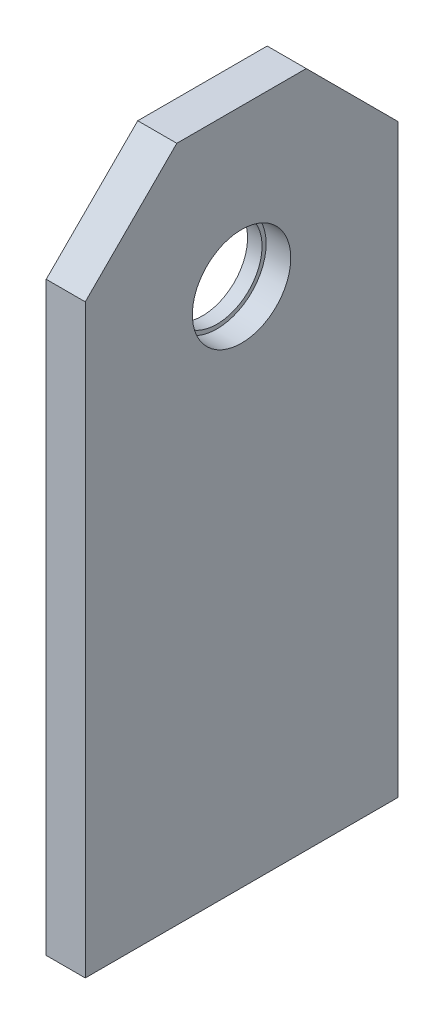
ISO-10303-21;
HEADER;
FILE_DESCRIPTION(('STEP AP214'),'2;1');
FILE_NAME('part.step','',(''),(''),'','','');
FILE_SCHEMA(('AUTOMOTIVE_DESIGN { 1 0 10303 214 1 1 1 1 }'));
ENDSEC;
DATA;
#1=APPLICATION_CONTEXT('core data for automotive mechanical design processes');
#2=APPLICATION_PROTOCOL_DEFINITION('international standard','automotive_design',2000,#1);
#3=PRODUCT_CONTEXT('',#1,'mechanical');
#4=PRODUCT('Part','Part','',(#3));
#5=PRODUCT_RELATED_PRODUCT_CATEGORY('part','',(#4));
#6=PRODUCT_DEFINITION_FORMATION('','',#4);
#7=PRODUCT_DEFINITION_CONTEXT('part definition',#1,'design');
#8=PRODUCT_DEFINITION('design','',#6,#7);
#9=PRODUCT_DEFINITION_SHAPE('','',#8);
#10=(LENGTH_UNIT() NAMED_UNIT(*) SI_UNIT(.MILLI.,.METRE.));
#11=(NAMED_UNIT(*) PLANE_ANGLE_UNIT() SI_UNIT($,.RADIAN.));
#12=(NAMED_UNIT(*) SI_UNIT($,.STERADIAN.) SOLID_ANGLE_UNIT());
#13=UNCERTAINTY_MEASURE_WITH_UNIT(LENGTH_MEASURE(1.E-05),#10,'distance_accuracy_value','');
#14=(GEOMETRIC_REPRESENTATION_CONTEXT(3) GLOBAL_UNCERTAINTY_ASSIGNED_CONTEXT((#13)) GLOBAL_UNIT_ASSIGNED_CONTEXT((#10,
#11,#12)) REPRESENTATION_CONTEXT('',''));
#15=CARTESIAN_POINT('',(0.,0.,0.));
#16=DIRECTION('',(0.,0.,1.));
#17=DIRECTION('',(1.,0.,0.));
#18=AXIS2_PLACEMENT_3D('',#15,#16,#17);
#19=CARTESIAN_POINT('',(4.7625,0.,0.));
#20=DIRECTION('',(-1.,0.,0.));
#21=DIRECTION('',(0.,0.,1.));
#22=AXIS2_PLACEMENT_3D('',#19,#20,#21);
#23=CYLINDRICAL_SURFACE('',#22,11.);
#24=CARTESIAN_POINT('',(-4.7625,0.,0.));
#25=DIRECTION('',(1.,0.,0.));
#26=DIRECTION('',(0.,0.,-1.));
#27=AXIS2_PLACEMENT_3D('',#24,#25,#26);
#28=CIRCLE('',#27,11.);
#29=CARTESIAN_POINT('',(-4.7625,0.,11.));
#30=VERTEX_POINT('',#29);
#31=EDGE_CURVE('E131',#30,#30,#28,.T.);
#32=CARTESIAN_POINT('',(-1.2375,0.,0.));
#33=DIRECTION('',(1.,0.,0.));
#34=DIRECTION('',(0.,0.,-1.));
#35=AXIS2_PLACEMENT_3D('',#32,#33,#34);
#36=CIRCLE('',#35,11.);
#37=CARTESIAN_POINT('',(-1.2375,0.,11.));
#38=VERTEX_POINT('',#37);
#39=EDGE_CURVE('E45',#38,#38,#36,.T.);
#40=CARTESIAN_POINT('',(-4.7625,0.,11.));
#41=CARTESIAN_POINT('',(-4.72578125,0.,11.));
#42=CARTESIAN_POINT('',(-4.6890625,0.,11.));
#43=CARTESIAN_POINT('',(-4.615625,0.,11.));
#44=CARTESIAN_POINT('',(-4.57890625,0.,11.));
#45=CARTESIAN_POINT('',(-4.50546875,0.,11.));
#46=CARTESIAN_POINT('',(-4.46875,0.,11.));
#47=CARTESIAN_POINT('',(-4.3953125,0.,11.));
#48=CARTESIAN_POINT('',(-4.35859375,0.,11.));
#49=CARTESIAN_POINT('',(-4.28515625,0.,11.));
#50=CARTESIAN_POINT('',(-4.2484375,0.,11.));
#51=CARTESIAN_POINT('',(-4.175,0.,11.));
#52=CARTESIAN_POINT('',(-4.13828125,0.,11.));
#53=CARTESIAN_POINT('',(-4.06484375,0.,11.));
#54=CARTESIAN_POINT('',(-4.028125,0.,11.));
#55=CARTESIAN_POINT('',(-3.9546875,0.,11.));
#56=CARTESIAN_POINT('',(-3.91796875,0.,11.));
#57=CARTESIAN_POINT('',(-3.84453125,0.,11.));
#58=CARTESIAN_POINT('',(-3.8078125,0.,11.));
#59=CARTESIAN_POINT('',(-3.734375,0.,11.));
#60=CARTESIAN_POINT('',(-3.69765625,0.,11.));
#61=CARTESIAN_POINT('',(-3.62421875,0.,11.));
#62=CARTESIAN_POINT('',(-3.5875,0.,11.));
#63=CARTESIAN_POINT('',(-3.5140625,0.,11.));
#64=CARTESIAN_POINT('',(-3.47734375,0.,11.));
#65=CARTESIAN_POINT('',(-3.40390625,0.,11.));
#66=CARTESIAN_POINT('',(-3.3671875,0.,11.));
#67=CARTESIAN_POINT('',(-3.29375,0.,11.));
#68=CARTESIAN_POINT('',(-3.25703125,0.,11.));
#69=CARTESIAN_POINT('',(-3.18359375,0.,11.));
#70=CARTESIAN_POINT('',(-3.146875,0.,11.));
#71=CARTESIAN_POINT('',(-3.0734375,0.,11.));
#72=CARTESIAN_POINT('',(-3.03671875,0.,11.));
#73=CARTESIAN_POINT('',(-2.96328125,0.,11.));
#74=CARTESIAN_POINT('',(-2.9265625,0.,11.));
#75=CARTESIAN_POINT('',(-2.853125,0.,11.));
#76=CARTESIAN_POINT('',(-2.81640625,0.,11.));
#77=CARTESIAN_POINT('',(-2.74296875,0.,11.));
#78=CARTESIAN_POINT('',(-2.70625,0.,11.));
#79=CARTESIAN_POINT('',(-2.6328125,0.,11.));
#80=CARTESIAN_POINT('',(-2.59609375,0.,11.));
#81=CARTESIAN_POINT('',(-2.52265625,0.,11.));
#82=CARTESIAN_POINT('',(-2.4859375,0.,11.));
#83=CARTESIAN_POINT('',(-2.4125,0.,11.));
#84=CARTESIAN_POINT('',(-2.37578125,0.,11.));
#85=CARTESIAN_POINT('',(-2.30234375,0.,11.));
#86=CARTESIAN_POINT('',(-2.265625,0.,11.));
#87=CARTESIAN_POINT('',(-2.1921875,0.,11.));
#88=CARTESIAN_POINT('',(-2.15546875,0.,11.));
#89=CARTESIAN_POINT('',(-2.08203125,0.,11.));
#90=CARTESIAN_POINT('',(-2.0453125,0.,11.));
#91=CARTESIAN_POINT('',(-1.971875,0.,11.));
#92=CARTESIAN_POINT('',(-1.93515625,0.,11.));
#93=CARTESIAN_POINT('',(-1.86171875,0.,11.));
#94=CARTESIAN_POINT('',(-1.825,0.,11.));
#95=CARTESIAN_POINT('',(-1.7515625,0.,11.));
#96=CARTESIAN_POINT('',(-1.71484375,0.,11.));
#97=CARTESIAN_POINT('',(-1.64140625,0.,11.));
#98=CARTESIAN_POINT('',(-1.6046875,0.,11.));
#99=CARTESIAN_POINT('',(-1.53125,0.,11.));
#100=CARTESIAN_POINT('',(-1.49453125,0.,11.));
#101=CARTESIAN_POINT('',(-1.42109375,0.,11.));
#102=CARTESIAN_POINT('',(-1.384375,0.,11.));
#103=CARTESIAN_POINT('',(-1.3109375,0.,11.));
#104=CARTESIAN_POINT('',(-1.27421875,0.,11.));
#105=CARTESIAN_POINT('',(-1.2375,0.,11.));
#106=B_SPLINE_CURVE_WITH_KNOTS('',3,(#40,#41,#42,#43,#44,#45,#46,#47,#48,#49,#50,#51,#52,#53,
#54,#55,#56,#57,#58,#59,#60,#61,#62,#63,#64,#65,#66,#67,#68,#69,#70,#71,#72,#73,#74,#75,#76,#77,
#78,#79,#80,#81,#82,#83,#84,#85,#86,#87,#88,#89,#90,#91,#92,#93,#94,#95,#96,#97,#98,#99,#100,
#101,#102,#103,#104,#105),.UNSPECIFIED.,.F.,.F.,(4,2,2,2,2,2,2,2,2,2,2,2,2,2,2,2,2,2,2,2,2,2,2,
2,2,2,2,2,2,2,2,2,4),(0.,0.11015625,0.2203125,0.33046875,0.440625,0.55078125,0.6609375,
0.77109375,0.88125,0.99140625,1.1015625,1.21171875,1.321875,1.43203125,1.5421875,1.65234375,
1.7625,1.87265625,1.9828125,2.09296875,2.203125,2.31328125,2.4234375,2.53359375,2.64375,
2.75390625,2.8640625,2.97421875,3.084375,3.19453125,3.3046875,3.41484375,3.525),.UNSPECIFIED.);
#107=EDGE_CURVE('BSEAM41',#30,#38,#106,.T.);
#108=ORIENTED_EDGE('',*,*,#31,.F.);
#109=ORIENTED_EDGE('',*,*,#39,.T.);
#110=ORIENTED_EDGE('',*,*,#107,.T.);
#111=ORIENTED_EDGE('',*,*,#107,.F.);
#112=EDGE_LOOP('',(#108,#110,#109,#111));
#113=FACE_BOUND('',#112,.T.);
#114=ADVANCED_FACE('F41',(#113),#23,.F.);
#115=CARTESIAN_POINT('',(4.7625,0.,0.));
#116=DIRECTION('',(-1.,0.,0.));
#117=DIRECTION('',(0.,0.,1.));
#118=AXIS2_PLACEMENT_3D('',#115,#116,#117);
#119=PLANE('',#118);
#120=CARTESIAN_POINT('',(4.7625,0.,0.));
#121=DIRECTION('',(1.,0.,0.));
#122=DIRECTION('',(0.,0.,-1.));
#123=AXIS2_PLACEMENT_3D('',#120,#121,#122);
#124=CIRCLE('',#123,12.);
#125=CARTESIAN_POINT('',(4.7625,0.,-12.));
#126=VERTEX_POINT('',#125);
#127=EDGE_CURVE('E207',#126,#126,#124,.T.);
#128=ORIENTED_EDGE('',*,*,#127,.F.);
#129=EDGE_LOOP('',(#128));
#130=FACE_BOUND('',#129,.T.);
#131=DIRECTION('',(0.,0.,-1.));
#132=VECTOR('',#131,1.);
#133=CARTESIAN_POINT('',(4.7625,-127.,-38.1));
#134=LINE('',#133,#132);
#135=CARTESIAN_POINT('',(4.7625,-127.,38.1));
#136=VERTEX_POINT('',#135);
#137=CARTESIAN_POINT('',(4.7625,-127.,-38.1));
#138=VERTEX_POINT('',#137);
#139=EDGE_CURVE('E138',#136,#138,#134,.T.);
#140=ORIENTED_EDGE('',*,*,#139,.T.);
#141=DIRECTION('',(0.,1.,0.));
#142=VECTOR('',#141,1.);
#143=CARTESIAN_POINT('',(4.7625,15.7815367264146,-38.1));
#144=LINE('',#143,#142);
#145=CARTESIAN_POINT('',(4.7625,15.7815367264146,-38.1));
#146=VERTEX_POINT('',#145);
#147=EDGE_CURVE('E96',#138,#146,#144,.T.);
#148=ORIENTED_EDGE('',*,*,#147,.T.);
#149=DIRECTION('',(0.,0.707106781186551,0.707106781186544));
#150=VECTOR('',#149,1.);
#151=CARTESIAN_POINT('',(4.7625,38.0999999999999,-15.781536726415));
#152=LINE('',#151,#150);
#153=CARTESIAN_POINT('',(4.7625,38.0999999999999,-15.781536726415));
#154=VERTEX_POINT('',#153);
#155=EDGE_CURVE('E109',#146,#154,#152,.T.);
#156=ORIENTED_EDGE('',*,*,#155,.T.);
#157=DIRECTION('',(0.,0.,1.));
#158=VECTOR('',#157,1.);
#159=CARTESIAN_POINT('',(4.7625,38.0999999999999,15.781536726415));
#160=LINE('',#159,#158);
#161=CARTESIAN_POINT('',(4.7625,38.0999999999999,15.781536726415));
#162=VERTEX_POINT('',#161);
#163=EDGE_CURVE('E103',#154,#162,#160,.T.);
#164=ORIENTED_EDGE('',*,*,#163,.T.);
#165=DIRECTION('',(0.,-0.707106781186551,0.707106781186544));
#166=VECTOR('',#165,1.);
#167=CARTESIAN_POINT('',(4.7625,15.7815367264146,38.1));
#168=LINE('',#167,#166);
#169=CARTESIAN_POINT('',(4.7625,15.7815367264146,38.1));
#170=VERTEX_POINT('',#169);
#171=EDGE_CURVE('E107',#162,#170,#168,.T.);
#172=ORIENTED_EDGE('',*,*,#171,.T.);
#173=DIRECTION('',(0.,-1.,0.));
#174=VECTOR('',#173,1.);
#175=CARTESIAN_POINT('',(4.7625,-127.,38.1));
#176=LINE('',#175,#174);
#177=EDGE_CURVE('E59',#170,#136,#176,.T.);
#178=ORIENTED_EDGE('',*,*,#177,.T.);
#179=EDGE_LOOP('',(#140,#148,#156,#164,#172,#178));
#180=FACE_BOUND('',#179,.T.);
#181=ADVANCED_FACE('F105',(#130,#180),#119,.F.);
#182=CARTESIAN_POINT('',(-4.7625,0.,0.));
#183=DIRECTION('',(-1.,0.,0.));
#184=DIRECTION('',(0.,0.,1.));
#185=AXIS2_PLACEMENT_3D('',#182,#183,#184);
#186=PLANE('',#185);
#187=DIRECTION('',(0.,0.,-1.));
#188=VECTOR('',#187,1.);
#189=CARTESIAN_POINT('',(-4.7625,-127.,-38.1));
#190=LINE('',#189,#188);
#191=CARTESIAN_POINT('',(-4.7625,-127.,38.1));
#192=VERTEX_POINT('',#191);
#193=CARTESIAN_POINT('',(-4.7625,-127.,-38.1));
#194=VERTEX_POINT('',#193);
#195=EDGE_CURVE('E127',#192,#194,#190,.T.);
#196=ORIENTED_EDGE('',*,*,#195,.F.);
#197=DIRECTION('',(0.,-1.,0.));
#198=VECTOR('',#197,1.);
#199=CARTESIAN_POINT('',(-4.7625,-127.,38.1));
#200=LINE('',#199,#198);
#201=CARTESIAN_POINT('',(-4.7625,15.7815367264146,38.1));
#202=VERTEX_POINT('',#201);
#203=EDGE_CURVE('E88',#202,#192,#200,.T.);
#204=ORIENTED_EDGE('',*,*,#203,.F.);
#205=DIRECTION('',(0.,-0.707106781186551,0.707106781186544));
#206=VECTOR('',#205,1.);
#207=CARTESIAN_POINT('',(-4.7625,15.7815367264146,38.1));
#208=LINE('',#207,#206);
#209=CARTESIAN_POINT('',(-4.7625,38.0999999999999,15.781536726415));
#210=VERTEX_POINT('',#209);
#211=EDGE_CURVE('E82',#210,#202,#208,.T.);
#212=ORIENTED_EDGE('',*,*,#211,.F.);
#213=DIRECTION('',(0.,0.,1.));
#214=VECTOR('',#213,1.);
#215=CARTESIAN_POINT('',(-4.7625,38.0999999999999,15.781536726415));
#216=LINE('',#215,#214);
#217=CARTESIAN_POINT('',(-4.7625,38.0999999999999,-15.781536726415));
#218=VERTEX_POINT('',#217);
#219=EDGE_CURVE('E117',#218,#210,#216,.T.);
#220=ORIENTED_EDGE('',*,*,#219,.F.);
#221=DIRECTION('',(0.,0.707106781186551,0.707106781186544));
#222=VECTOR('',#221,1.);
#223=CARTESIAN_POINT('',(-4.7625,38.0999999999999,-15.781536726415));
#224=LINE('',#223,#222);
#225=CARTESIAN_POINT('',(-4.7625,15.7815367264146,-38.1));
#226=VERTEX_POINT('',#225);
#227=EDGE_CURVE('E133',#226,#218,#224,.T.);
#228=ORIENTED_EDGE('',*,*,#227,.F.);
#229=DIRECTION('',(0.,1.,0.));
#230=VECTOR('',#229,1.);
#231=CARTESIAN_POINT('',(-4.7625,15.7815367264146,-38.1));
#232=LINE('',#231,#230);
#233=EDGE_CURVE('E130',#194,#226,#232,.T.);
#234=ORIENTED_EDGE('',*,*,#233,.F.);
#235=EDGE_LOOP('',(#196,#204,#212,#220,#228,#234));
#236=FACE_BOUND('',#235,.T.);
#237=ORIENTED_EDGE('',*,*,#31,.T.);
#238=EDGE_LOOP('',(#237));
#239=FACE_BOUND('',#238,.T.);
#240=ADVANCED_FACE('F148',(#236,#239),#186,.T.);
#241=CARTESIAN_POINT('',(4.7625,-127.,-38.1));
#242=DIRECTION('',(0.,1.,0.));
#243=DIRECTION('',(0.,0.,1.));
#244=AXIS2_PLACEMENT_3D('',#241,#242,#243);
#245=PLANE('',#244);
#246=CARTESIAN_POINT('',(0.,-127.,30.1625));
#247=DIRECTION('',(0.,-1.,0.));
#248=DIRECTION('',(0.,0.,-1.));
#249=AXIS2_PLACEMENT_3D('',#246,#247,#248);
#250=CIRCLE('',#249,2.778125);
#251=CARTESIAN_POINT('',(0.,-127.,27.384375));
#252=VERTEX_POINT('',#251);
#253=EDGE_CURVE('E191',#252,#252,#250,.T.);
#254=ORIENTED_EDGE('',*,*,#253,.F.);
#255=EDGE_LOOP('',(#254));
#256=FACE_BOUND('',#255,.T.);
#257=CARTESIAN_POINT('',(0.,-127.,-30.1625));
#258=DIRECTION('',(0.,-1.,0.));
#259=DIRECTION('',(0.,0.,-1.));
#260=AXIS2_PLACEMENT_3D('',#257,#258,#259);
#261=CIRCLE('',#260,2.778125);
#262=CARTESIAN_POINT('',(0.,-127.,-32.940625));
#263=VERTEX_POINT('',#262);
#264=EDGE_CURVE('E194',#263,#263,#261,.T.);
#265=ORIENTED_EDGE('',*,*,#264,.F.);
#266=EDGE_LOOP('',(#265));
#267=FACE_BOUND('',#266,.T.);
#268=ORIENTED_EDGE('',*,*,#195,.T.);
#269=DIRECTION('',(-1.,0.,0.));
#270=VECTOR('',#269,1.);
#271=CARTESIAN_POINT('',(4.7625,-127.,-38.1));
#272=LINE('',#271,#270);
#273=EDGE_CURVE('E11',#138,#194,#272,.T.);
#274=ORIENTED_EDGE('',*,*,#273,.F.);
#275=ORIENTED_EDGE('',*,*,#139,.F.);
#276=DIRECTION('',(-1.,0.,0.));
#277=VECTOR('',#276,1.);
#278=CARTESIAN_POINT('',(4.7625,-127.,38.1));
#279=LINE('',#278,#277);
#280=EDGE_CURVE('E123',#136,#192,#279,.T.);
#281=ORIENTED_EDGE('',*,*,#280,.T.);
#282=EDGE_LOOP('',(#268,#274,#275,#281));
#283=FACE_BOUND('',#282,.T.);
#284=ADVANCED_FACE('F43',(#256,#267,#283),#245,.F.);
#285=CARTESIAN_POINT('',(4.7625,15.7815367264146,-38.1));
#286=DIRECTION('',(0.,0.,1.));
#287=DIRECTION('',(0.,-1.,0.));
#288=AXIS2_PLACEMENT_3D('',#285,#286,#287);
#289=PLANE('',#288);
#290=ORIENTED_EDGE('',*,*,#233,.T.);
#291=DIRECTION('',(-1.,0.,0.));
#292=VECTOR('',#291,1.);
#293=CARTESIAN_POINT('',(4.7625,15.7815367264146,-38.1));
#294=LINE('',#293,#292);
#295=EDGE_CURVE('E51',#146,#226,#294,.T.);
#296=ORIENTED_EDGE('',*,*,#295,.F.);
#297=ORIENTED_EDGE('',*,*,#147,.F.);
#298=ORIENTED_EDGE('',*,*,#273,.T.);
#299=EDGE_LOOP('',(#290,#296,#297,#298));
#300=FACE_BOUND('',#299,.T.);
#301=ADVANCED_FACE('F182',(#300),#289,.F.);
#302=CARTESIAN_POINT('',(4.7625,38.0999999999999,-15.781536726415));
#303=DIRECTION('',(0.,-0.707106781186544,0.707106781186551));
#304=DIRECTION('',(0.,-0.707106781186551,-0.707106781186544));
#305=AXIS2_PLACEMENT_3D('',#302,#303,#304);
#306=PLANE('',#305);
#307=ORIENTED_EDGE('',*,*,#227,.T.);
#308=DIRECTION('',(-1.,0.,0.));
#309=VECTOR('',#308,1.);
#310=CARTESIAN_POINT('',(4.7625,38.0999999999999,-15.781536726415));
#311=LINE('',#310,#309);
#312=EDGE_CURVE('E118',#154,#218,#311,.T.);
#313=ORIENTED_EDGE('',*,*,#312,.F.);
#314=ORIENTED_EDGE('',*,*,#155,.F.);
#315=ORIENTED_EDGE('',*,*,#295,.T.);
#316=EDGE_LOOP('',(#307,#313,#314,#315));
#317=FACE_BOUND('',#316,.T.);
#318=ADVANCED_FACE('F145',(#317),#306,.F.);
#319=CARTESIAN_POINT('',(4.7625,38.0999999999999,15.781536726415));
#320=DIRECTION('',(0.,-1.,0.));
#321=DIRECTION('',(0.,0.,-1.));
#322=AXIS2_PLACEMENT_3D('',#319,#320,#321);
#323=PLANE('',#322);
#324=ORIENTED_EDGE('',*,*,#219,.T.);
#325=DIRECTION('',(-1.,0.,0.));
#326=VECTOR('',#325,1.);
#327=CARTESIAN_POINT('',(4.7625,38.0999999999999,15.781536726415));
#328=LINE('',#327,#326);
#329=EDGE_CURVE('E114',#162,#210,#328,.T.);
#330=ORIENTED_EDGE('',*,*,#329,.F.);
#331=ORIENTED_EDGE('',*,*,#163,.F.);
#332=ORIENTED_EDGE('',*,*,#312,.T.);
#333=EDGE_LOOP('',(#324,#330,#331,#332));
#334=FACE_BOUND('',#333,.T.);
#335=ADVANCED_FACE('F115',(#334),#323,.F.);
#336=CARTESIAN_POINT('',(4.7625,15.7815367264146,38.1));
#337=DIRECTION('',(0.,-0.707106781186544,-0.707106781186551));
#338=DIRECTION('',(0.,0.707106781186551,-0.707106781186544));
#339=AXIS2_PLACEMENT_3D('',#336,#337,#338);
#340=PLANE('',#339);
#341=ORIENTED_EDGE('',*,*,#211,.T.);
#342=DIRECTION('',(-1.,0.,0.));
#343=VECTOR('',#342,1.);
#344=CARTESIAN_POINT('',(4.7625,15.7815367264146,38.1));
#345=LINE('',#344,#343);
#346=EDGE_CURVE('E119',#170,#202,#345,.T.);
#347=ORIENTED_EDGE('',*,*,#346,.F.);
#348=ORIENTED_EDGE('',*,*,#171,.F.);
#349=ORIENTED_EDGE('',*,*,#329,.T.);
#350=EDGE_LOOP('',(#341,#347,#348,#349));
#351=FACE_BOUND('',#350,.T.);
#352=ADVANCED_FACE('F121',(#351),#340,.F.);
#353=CARTESIAN_POINT('',(4.7625,-127.,38.1));
#354=DIRECTION('',(0.,0.,-1.));
#355=DIRECTION('',(0.,1.,0.));
#356=AXIS2_PLACEMENT_3D('',#353,#354,#355);
#357=PLANE('',#356);
#358=ORIENTED_EDGE('',*,*,#203,.T.);
#359=ORIENTED_EDGE('',*,*,#280,.F.);
#360=ORIENTED_EDGE('',*,*,#177,.F.);
#361=ORIENTED_EDGE('',*,*,#346,.T.);
#362=EDGE_LOOP('',(#358,#359,#360,#361));
#363=FACE_BOUND('',#362,.T.);
#364=ADVANCED_FACE('F153',(#363),#357,.F.);
#365=CARTESIAN_POINT('',(-1.2375,0.,0.));
#366=DIRECTION('',(1.,0.,0.));
#367=DIRECTION('',(0.,0.,-1.));
#368=AXIS2_PLACEMENT_3D('',#365,#366,#367);
#369=CYLINDRICAL_SURFACE('',#368,12.);
#370=CARTESIAN_POINT('',(-1.2375,0.,0.));
#371=DIRECTION('',(1.,0.,0.));
#372=DIRECTION('',(0.,0.,-1.));
#373=AXIS2_PLACEMENT_3D('',#370,#371,#372);
#374=CIRCLE('',#373,12.);
#375=CARTESIAN_POINT('',(-1.2375,0.,-12.));
#376=VERTEX_POINT('',#375);
#377=EDGE_CURVE('E204',#376,#376,#374,.T.);
#378=ORIENTED_EDGE('',*,*,#377,.F.);
#379=EDGE_LOOP('',(#378));
#380=FACE_BOUND('',#379,.T.);
#381=ORIENTED_EDGE('',*,*,#127,.T.);
#382=EDGE_LOOP('',(#381));
#383=FACE_BOUND('',#382,.T.);
#384=ADVANCED_FACE('F155',(#380,#383),#369,.F.);
#385=CARTESIAN_POINT('',(-1.2375,0.,0.));
#386=DIRECTION('',(1.,0.,0.));
#387=DIRECTION('',(0.,0.,-1.));
#388=AXIS2_PLACEMENT_3D('',#385,#386,#387);
#389=PLANE('',#388);
#390=ORIENTED_EDGE('',*,*,#39,.F.);
#391=EDGE_LOOP('',(#390));
#392=FACE_BOUND('',#391,.T.);
#393=ORIENTED_EDGE('',*,*,#377,.T.);
#394=EDGE_LOOP('',(#393));
#395=FACE_BOUND('',#394,.T.);
#396=ADVANCED_FACE('F162',(#392,#395),#389,.T.);
#397=CARTESIAN_POINT('',(0.,-101.6,-30.1625));
#398=DIRECTION('',(0.,-1.,0.));
#399=DIRECTION('',(0.,0.,-1.));
#400=AXIS2_PLACEMENT_3D('',#397,#398,#399);
#401=CYLINDRICAL_SURFACE('',#400,2.778125);
#402=CARTESIAN_POINT('',(0.,-101.6,-30.1625));
#403=DIRECTION('',(0.,-1.,0.));
#404=DIRECTION('',(0.,0.,-1.));
#405=AXIS2_PLACEMENT_3D('',#402,#403,#404);
#406=CIRCLE('',#405,2.778125);
#407=CARTESIAN_POINT('',(0.,-101.6,-32.940625));
#408=VERTEX_POINT('',#407);
#409=EDGE_CURVE('E196',#408,#408,#406,.T.);
#410=ORIENTED_EDGE('',*,*,#409,.F.);
#411=EDGE_LOOP('',(#410));
#412=FACE_BOUND('',#411,.T.);
#413=ORIENTED_EDGE('',*,*,#264,.T.);
#414=EDGE_LOOP('',(#413));
#415=FACE_BOUND('',#414,.T.);
#416=ADVANCED_FACE('F217',(#412,#415),#401,.F.);
#417=CARTESIAN_POINT('',(0.,-101.6,-30.1625));
#418=DIRECTION('',(0.,-1.,0.));
#419=DIRECTION('',(0.,0.,-1.));
#420=AXIS2_PLACEMENT_3D('',#417,#418,#419);
#421=PLANE('',#420);
#422=ORIENTED_EDGE('',*,*,#409,.T.);
#423=EDGE_LOOP('',(#422));
#424=FACE_BOUND('',#423,.T.);
#425=ADVANCED_FACE('F223',(#424),#421,.T.);
#426=CARTESIAN_POINT('',(0.,-101.6,30.1625));
#427=DIRECTION('',(0.,-1.,0.));
#428=DIRECTION('',(0.,0.,-1.));
#429=AXIS2_PLACEMENT_3D('',#426,#427,#428);
#430=CYLINDRICAL_SURFACE('',#429,2.778125);
#431=CARTESIAN_POINT('',(0.,-101.6,30.1625));
#432=DIRECTION('',(0.,-1.,0.));
#433=DIRECTION('',(0.,0.,-1.));
#434=AXIS2_PLACEMENT_3D('',#431,#432,#433);
#435=CIRCLE('',#434,2.778125);
#436=CARTESIAN_POINT('',(0.,-101.6,27.384375));
#437=VERTEX_POINT('',#436);
#438=EDGE_CURVE('E198',#437,#437,#435,.T.);
#439=ORIENTED_EDGE('',*,*,#438,.F.);
#440=EDGE_LOOP('',(#439));
#441=FACE_BOUND('',#440,.T.);
#442=ORIENTED_EDGE('',*,*,#253,.T.);
#443=EDGE_LOOP('',(#442));
#444=FACE_BOUND('',#443,.T.);
#445=ADVANCED_FACE('F228',(#441,#444),#430,.F.);
#446=CARTESIAN_POINT('',(0.,-101.6,30.1625));
#447=DIRECTION('',(0.,-1.,0.));
#448=DIRECTION('',(0.,0.,-1.));
#449=AXIS2_PLACEMENT_3D('',#446,#447,#448);
#450=PLANE('',#449);
#451=ORIENTED_EDGE('',*,*,#438,.T.);
#452=EDGE_LOOP('',(#451));
#453=FACE_BOUND('',#452,.T.);
#454=ADVANCED_FACE('F233',(#453),#450,.T.);
#455=CLOSED_SHELL('',(#114,#181,#240,#284,#301,#318,#335,#352,#364,#384,#396,#416,#425,#445,#454));
#456=MANIFOLD_SOLID_BREP('B2',#455);
#457=ADVANCED_BREP_SHAPE_REPRESENTATION('',(#18,#456),#14);
#458=SHAPE_DEFINITION_REPRESENTATION(#9,#457);
ENDSEC;
END-ISO-10303-21;
